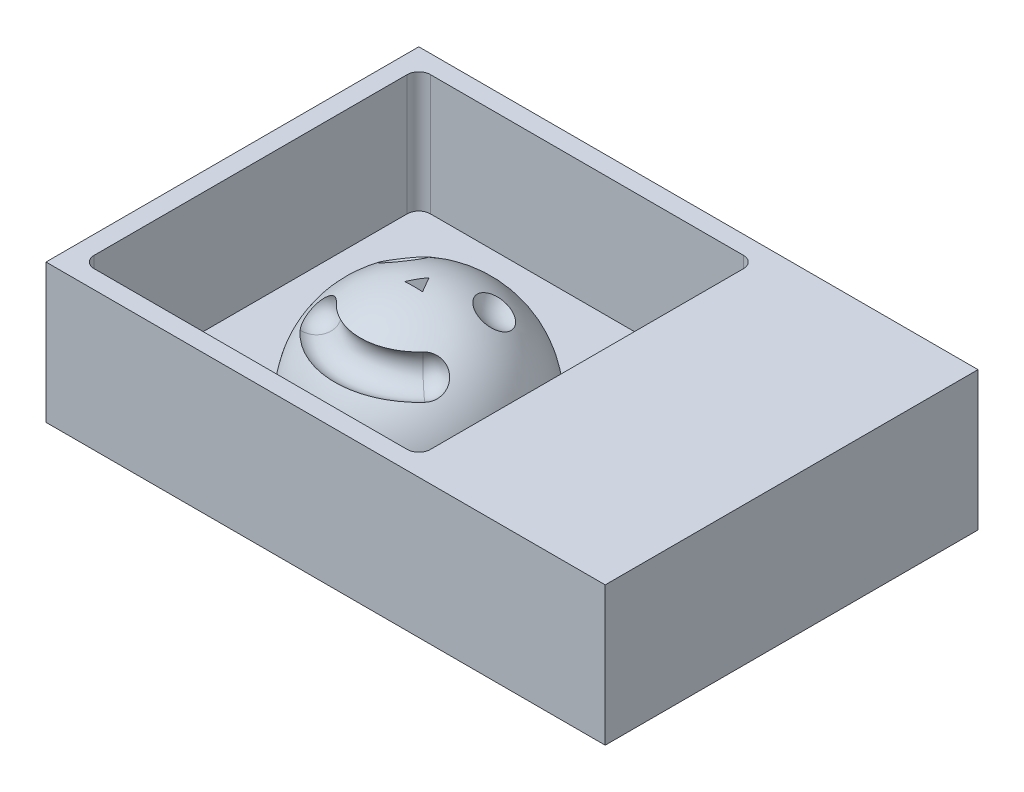
ISO-10303-21;
HEADER;
FILE_DESCRIPTION(('STEP AP214'),'2;1');
FILE_NAME('part.step','',(''),(''),'','','');
FILE_SCHEMA(('AUTOMOTIVE_DESIGN { 1 0 10303 214 1 1 1 1 }'));
ENDSEC;
DATA;
#1=APPLICATION_CONTEXT('core data for automotive mechanical design processes');
#2=APPLICATION_PROTOCOL_DEFINITION('international standard','automotive_design',2000,#1);
#3=PRODUCT_CONTEXT('',#1,'mechanical');
#4=PRODUCT('Part','Part','',(#3));
#5=PRODUCT_RELATED_PRODUCT_CATEGORY('part','',(#4));
#6=PRODUCT_DEFINITION_FORMATION('','',#4);
#7=PRODUCT_DEFINITION_CONTEXT('part definition',#1,'design');
#8=PRODUCT_DEFINITION('design','',#6,#7);
#9=PRODUCT_DEFINITION_SHAPE('','',#8);
#10=(LENGTH_UNIT() NAMED_UNIT(*) SI_UNIT(.MILLI.,.METRE.));
#11=(NAMED_UNIT(*) PLANE_ANGLE_UNIT() SI_UNIT($,.RADIAN.));
#12=(NAMED_UNIT(*) SI_UNIT($,.STERADIAN.) SOLID_ANGLE_UNIT());
#13=UNCERTAINTY_MEASURE_WITH_UNIT(LENGTH_MEASURE(1.E-05),#10,'distance_accuracy_value','');
#14=(GEOMETRIC_REPRESENTATION_CONTEXT(3) GLOBAL_UNCERTAINTY_ASSIGNED_CONTEXT((#13)) GLOBAL_UNIT_ASSIGNED_CONTEXT((#10,
#11,#12)) REPRESENTATION_CONTEXT('',''));
#15=CARTESIAN_POINT('',(0.,0.,0.));
#16=DIRECTION('',(0.,0.,1.));
#17=DIRECTION('',(1.,0.,0.));
#18=AXIS2_PLACEMENT_3D('',#15,#16,#17);
#19=CARTESIAN_POINT('',(-153.,38.,0.));
#20=DIRECTION('',(1.,0.,0.));
#21=DIRECTION('',(0.,0.,-1.));
#22=AXIS2_PLACEMENT_3D('',#19,#20,#21);
#23=PLANE('',#22);
#24=DIRECTION('',(0.,0.,1.));
#25=VECTOR('',#24,1.);
#26=CARTESIAN_POINT('',(-153.,0.,0.));
#27=LINE('',#26,#25);
#28=CARTESIAN_POINT('',(-153.,0.,-102.));
#29=VERTEX_POINT('',#28);
#30=CARTESIAN_POINT('',(-153.,0.,0.));
#31=VERTEX_POINT('',#30);
#32=EDGE_CURVE('E222',#29,#31,#27,.T.);
#33=ORIENTED_EDGE('',*,*,#32,.T.);
#34=DIRECTION('',(0.,-1.,0.));
#35=VECTOR('',#34,1.);
#36=CARTESIAN_POINT('',(-153.,38.,0.));
#37=LINE('',#36,#35);
#38=CARTESIAN_POINT('',(-153.,38.,0.));
#39=VERTEX_POINT('',#38);
#40=EDGE_CURVE('E299',#39,#31,#37,.T.);
#41=ORIENTED_EDGE('',*,*,#40,.F.);
#42=DIRECTION('',(0.,0.,1.));
#43=VECTOR('',#42,1.);
#44=CARTESIAN_POINT('',(-153.,38.,0.));
#45=LINE('',#44,#43);
#46=CARTESIAN_POINT('',(-153.,38.,-102.));
#47=VERTEX_POINT('',#46);
#48=EDGE_CURVE('E262',#47,#39,#45,.T.);
#49=ORIENTED_EDGE('',*,*,#48,.F.);
#50=DIRECTION('',(0.,-1.,0.));
#51=VECTOR('',#50,1.);
#52=CARTESIAN_POINT('',(-153.,38.,-102.));
#53=LINE('',#52,#51);
#54=EDGE_CURVE('E276',#47,#29,#53,.T.);
#55=ORIENTED_EDGE('',*,*,#54,.T.);
#56=EDGE_LOOP('',(#33,#41,#49,#55));
#57=FACE_BOUND('',#56,.T.);
#58=ADVANCED_FACE('F50',(#57),#23,.F.);
#59=CARTESIAN_POINT('',(-153.,38.,0.));
#60=DIRECTION('',(0.,0.,-1.));
#61=DIRECTION('',(-1.,0.,0.));
#62=AXIS2_PLACEMENT_3D('',#59,#60,#61);
#63=PLANE('',#62);
#64=DIRECTION('',(1.,0.,0.));
#65=VECTOR('',#64,1.);
#66=CARTESIAN_POINT('',(-153.,0.,0.));
#67=LINE('',#66,#65);
#68=CARTESIAN_POINT('',(0.,0.,0.));
#69=VERTEX_POINT('',#68);
#70=EDGE_CURVE('E280',#31,#69,#67,.T.);
#71=ORIENTED_EDGE('',*,*,#70,.T.);
#72=DIRECTION('',(0.,-1.,0.));
#73=VECTOR('',#72,1.);
#74=CARTESIAN_POINT('',(0.,38.,0.));
#75=LINE('',#74,#73);
#76=CARTESIAN_POINT('',(0.,38.,0.));
#77=VERTEX_POINT('',#76);
#78=EDGE_CURVE('E295',#77,#69,#75,.T.);
#79=ORIENTED_EDGE('',*,*,#78,.F.);
#80=DIRECTION('',(1.,0.,0.));
#81=VECTOR('',#80,1.);
#82=CARTESIAN_POINT('',(-153.,38.,0.));
#83=LINE('',#82,#81);
#84=EDGE_CURVE('E266',#39,#77,#83,.T.);
#85=ORIENTED_EDGE('',*,*,#84,.F.);
#86=ORIENTED_EDGE('',*,*,#40,.T.);
#87=EDGE_LOOP('',(#71,#79,#85,#86));
#88=FACE_BOUND('',#87,.T.);
#89=ADVANCED_FACE('F430',(#88),#63,.F.);
#90=CARTESIAN_POINT('',(0.,38.,0.));
#91=DIRECTION('',(-1.,0.,0.));
#92=DIRECTION('',(0.,0.,1.));
#93=AXIS2_PLACEMENT_3D('',#90,#91,#92);
#94=PLANE('',#93);
#95=DIRECTION('',(0.,0.,-1.));
#96=VECTOR('',#95,1.);
#97=CARTESIAN_POINT('',(0.,0.,0.));
#98=LINE('',#97,#96);
#99=CARTESIAN_POINT('',(0.,0.,-102.));
#100=VERTEX_POINT('',#99);
#101=EDGE_CURVE('E283',#69,#100,#98,.T.);
#102=ORIENTED_EDGE('',*,*,#101,.T.);
#103=DIRECTION('',(0.,-1.,0.));
#104=VECTOR('',#103,1.);
#105=CARTESIAN_POINT('',(0.,38.,-102.));
#106=LINE('',#105,#104);
#107=CARTESIAN_POINT('',(0.,38.,-102.));
#108=VERTEX_POINT('',#107);
#109=EDGE_CURVE('E291',#108,#100,#106,.T.);
#110=ORIENTED_EDGE('',*,*,#109,.F.);
#111=DIRECTION('',(0.,0.,-1.));
#112=VECTOR('',#111,1.);
#113=CARTESIAN_POINT('',(0.,38.,0.));
#114=LINE('',#113,#112);
#115=EDGE_CURVE('E270',#77,#108,#114,.T.);
#116=ORIENTED_EDGE('',*,*,#115,.F.);
#117=ORIENTED_EDGE('',*,*,#78,.T.);
#118=EDGE_LOOP('',(#102,#110,#116,#117));
#119=FACE_BOUND('',#118,.T.);
#120=ADVANCED_FACE('F436',(#119),#94,.F.);
#121=CARTESIAN_POINT('',(-153.,38.,-102.));
#122=DIRECTION('',(0.,0.,1.));
#123=DIRECTION('',(1.,0.,0.));
#124=AXIS2_PLACEMENT_3D('',#121,#122,#123);
#125=PLANE('',#124);
#126=DIRECTION('',(-1.,0.,0.));
#127=VECTOR('',#126,1.);
#128=CARTESIAN_POINT('',(-153.,0.,-102.));
#129=LINE('',#128,#127);
#130=EDGE_CURVE('E267',#100,#29,#129,.T.);
#131=ORIENTED_EDGE('',*,*,#130,.T.);
#132=ORIENTED_EDGE('',*,*,#54,.F.);
#133=DIRECTION('',(-1.,0.,0.));
#134=VECTOR('',#133,1.);
#135=CARTESIAN_POINT('',(-153.,38.,-102.));
#136=LINE('',#135,#134);
#137=EDGE_CURVE('E273',#108,#47,#136,.T.);
#138=ORIENTED_EDGE('',*,*,#137,.F.);
#139=ORIENTED_EDGE('',*,*,#109,.T.);
#140=EDGE_LOOP('',(#131,#132,#138,#139));
#141=FACE_BOUND('',#140,.T.);
#142=ADVANCED_FACE('F484',(#141),#125,.F.);
#143=CARTESIAN_POINT('',(0.,38.,0.));
#144=DIRECTION('',(0.,-1.,0.));
#145=DIRECTION('',(0.,0.,-1.));
#146=AXIS2_PLACEMENT_3D('',#143,#144,#145);
#147=PLANE('',#146);
#148=DIRECTION('',(1.,0.,0.));
#149=VECTOR('',#148,1.);
#150=CARTESIAN_POINT('',(-148.,38.,-97.));
#151=LINE('',#150,#149);
#152=CARTESIAN_POINT('',(-144.825,38.,-97.));
#153=VERTEX_POINT('',#152);
#154=CARTESIAN_POINT('',(-59.175,38.,-97.));
#155=VERTEX_POINT('',#154);
#156=EDGE_CURVE('E254',#153,#155,#151,.T.);
#157=ORIENTED_EDGE('',*,*,#156,.T.);
#158=CARTESIAN_POINT('',(-59.175,38.,-93.825));
#159=DIRECTION('',(0.,-1.,0.));
#160=DIRECTION('',(0.,0.,-1.));
#161=AXIS2_PLACEMENT_3D('',#158,#159,#160);
#162=CIRCLE('',#161,3.175);
#163=CARTESIAN_POINT('',(-56.,38.,-93.825));
#164=VERTEX_POINT('',#163);
#165=EDGE_CURVE('E249',#155,#164,#162,.T.);
#166=ORIENTED_EDGE('',*,*,#165,.T.);
#167=DIRECTION('',(0.,0.,1.));
#168=VECTOR('',#167,1.);
#169=CARTESIAN_POINT('',(-56.,38.,-97.));
#170=LINE('',#169,#168);
#171=CARTESIAN_POINT('',(-56.,38.,-8.17500000000001));
#172=VERTEX_POINT('',#171);
#173=EDGE_CURVE('E229',#164,#172,#170,.T.);
#174=ORIENTED_EDGE('',*,*,#173,.T.);
#175=CARTESIAN_POINT('',(-59.175,38.,-8.17500000000001));
#176=DIRECTION('',(0.,-1.,0.));
#177=DIRECTION('',(0.,0.,-1.));
#178=AXIS2_PLACEMENT_3D('',#175,#176,#177);
#179=CIRCLE('',#178,3.175);
#180=CARTESIAN_POINT('',(-59.175,38.,-5.00000000000002));
#181=VERTEX_POINT('',#180);
#182=EDGE_CURVE('E243',#172,#181,#179,.T.);
#183=ORIENTED_EDGE('',*,*,#182,.T.);
#184=DIRECTION('',(1.,0.,0.));
#185=VECTOR('',#184,1.);
#186=CARTESIAN_POINT('',(-148.,38.,-5.));
#187=LINE('',#186,#185);
#188=CARTESIAN_POINT('',(-144.825,38.,-5.));
#189=VERTEX_POINT('',#188);
#190=EDGE_CURVE('E180',#189,#181,#187,.T.);
#191=ORIENTED_EDGE('',*,*,#190,.F.);
#192=CARTESIAN_POINT('',(-144.825,38.,-8.175));
#193=DIRECTION('',(0.,-1.,0.));
#194=DIRECTION('',(0.,0.,-1.));
#195=AXIS2_PLACEMENT_3D('',#192,#193,#194);
#196=CIRCLE('',#195,3.175);
#197=CARTESIAN_POINT('',(-148.,38.,-8.175));
#198=VERTEX_POINT('',#197);
#199=EDGE_CURVE('E238',#189,#198,#196,.T.);
#200=ORIENTED_EDGE('',*,*,#199,.T.);
#201=DIRECTION('',(0.,0.,1.));
#202=VECTOR('',#201,1.);
#203=CARTESIAN_POINT('',(-148.,38.,-97.));
#204=LINE('',#203,#202);
#205=CARTESIAN_POINT('',(-148.,38.,-93.825));
#206=VERTEX_POINT('',#205);
#207=EDGE_CURVE('E208',#206,#198,#204,.T.);
#208=ORIENTED_EDGE('',*,*,#207,.F.);
#209=CARTESIAN_POINT('',(-144.825,38.,-93.825));
#210=DIRECTION('',(0.,-1.,0.));
#211=DIRECTION('',(0.,0.,-1.));
#212=AXIS2_PLACEMENT_3D('',#209,#210,#211);
#213=CIRCLE('',#212,3.175);
#214=EDGE_CURVE('E242',#206,#153,#213,.T.);
#215=ORIENTED_EDGE('',*,*,#214,.T.);
#216=EDGE_LOOP('',(#157,#166,#174,#183,#191,#200,#208,#215));
#217=FACE_BOUND('',#216,.T.);
#218=ORIENTED_EDGE('',*,*,#48,.T.);
#219=ORIENTED_EDGE('',*,*,#84,.T.);
#220=ORIENTED_EDGE('',*,*,#115,.T.);
#221=ORIENTED_EDGE('',*,*,#137,.T.);
#222=EDGE_LOOP('',(#218,#219,#220,#221));
#223=FACE_BOUND('',#222,.T.);
#224=ADVANCED_FACE('F356',(#217,#223),#147,.F.);
#225=CARTESIAN_POINT('',(0.,0.,0.));
#226=DIRECTION('',(0.,-1.,0.));
#227=DIRECTION('',(0.,0.,-1.));
#228=AXIS2_PLACEMENT_3D('',#225,#226,#227);
#229=PLANE('',#228);
#230=ORIENTED_EDGE('',*,*,#32,.F.);
#231=ORIENTED_EDGE('',*,*,#130,.F.);
#232=ORIENTED_EDGE('',*,*,#101,.F.);
#233=ORIENTED_EDGE('',*,*,#70,.F.);
#234=EDGE_LOOP('',(#230,#231,#232,#233));
#235=FACE_BOUND('',#234,.T.);
#236=ADVANCED_FACE('F481',(#235),#229,.T.);
#237=CARTESIAN_POINT('',(-148.,5.,-5.));
#238=DIRECTION('',(0.,0.,1.));
#239=DIRECTION('',(1.,0.,0.));
#240=AXIS2_PLACEMENT_3D('',#237,#238,#239);
#241=PLANE('',#240);
#242=ORIENTED_EDGE('',*,*,#190,.T.);
#243=DIRECTION('',(0.,1.,0.));
#244=VECTOR('',#243,1.);
#245=CARTESIAN_POINT('',(-59.175,5.,-5.00000000000002));
#246=LINE('',#245,#244);
#247=CARTESIAN_POINT('',(-59.175,5.,-5.00000000000002));
#248=VERTEX_POINT('',#247);
#249=EDGE_CURVE('E318',#181,#248,#246,.F.);
#250=ORIENTED_EDGE('',*,*,#249,.T.);
#251=DIRECTION('',(1.,0.,0.));
#252=VECTOR('',#251,1.);
#253=CARTESIAN_POINT('',(-148.,5.,-5.));
#254=LINE('',#253,#252);
#255=CARTESIAN_POINT('',(-144.825,5.,-5.));
#256=VERTEX_POINT('',#255);
#257=EDGE_CURVE('E203',#256,#248,#254,.T.);
#258=ORIENTED_EDGE('',*,*,#257,.F.);
#259=DIRECTION('',(0.,1.,0.));
#260=VECTOR('',#259,1.);
#261=CARTESIAN_POINT('',(-144.825,38.,-5.));
#262=LINE('',#261,#260);
#263=EDGE_CURVE('E314',#256,#189,#262,.T.);
#264=ORIENTED_EDGE('',*,*,#263,.T.);
#265=EDGE_LOOP('',(#242,#250,#258,#264));
#266=FACE_BOUND('',#265,.T.);
#267=ADVANCED_FACE('F363',(#266),#241,.F.);
#268=CARTESIAN_POINT('',(-148.,5.,-97.));
#269=DIRECTION('',(-1.,0.,0.));
#270=DIRECTION('',(0.,0.,1.));
#271=AXIS2_PLACEMENT_3D('',#268,#269,#270);
#272=PLANE('',#271);
#273=ORIENTED_EDGE('',*,*,#207,.T.);
#274=DIRECTION('',(0.,1.,0.));
#275=VECTOR('',#274,1.);
#276=CARTESIAN_POINT('',(-148.,5.,-8.175));
#277=LINE('',#276,#275);
#278=CARTESIAN_POINT('',(-148.,5.,-8.175));
#279=VERTEX_POINT('',#278);
#280=EDGE_CURVE('E337',#198,#279,#277,.F.);
#281=ORIENTED_EDGE('',*,*,#280,.T.);
#282=DIRECTION('',(0.,0.,1.));
#283=VECTOR('',#282,1.);
#284=CARTESIAN_POINT('',(-148.,5.,-97.));
#285=LINE('',#284,#283);
#286=CARTESIAN_POINT('',(-148.,5.,-93.825));
#287=VERTEX_POINT('',#286);
#288=EDGE_CURVE('E217',#287,#279,#285,.T.);
#289=ORIENTED_EDGE('',*,*,#288,.F.);
#290=DIRECTION('',(0.,1.,0.));
#291=VECTOR('',#290,1.);
#292=CARTESIAN_POINT('',(-148.,5.,-93.825));
#293=LINE('',#292,#291);
#294=EDGE_CURVE('E333',#287,#206,#293,.T.);
#295=ORIENTED_EDGE('',*,*,#294,.T.);
#296=EDGE_LOOP('',(#273,#281,#289,#295));
#297=FACE_BOUND('',#296,.T.);
#298=ADVANCED_FACE('F471',(#297),#272,.F.);
#299=CARTESIAN_POINT('',(-148.,5.,-97.));
#300=DIRECTION('',(0.,0.,1.));
#301=DIRECTION('',(1.,0.,0.));
#302=AXIS2_PLACEMENT_3D('',#299,#300,#301);
#303=PLANE('',#302);
#304=ORIENTED_EDGE('',*,*,#156,.F.);
#305=DIRECTION('',(0.,1.,0.));
#306=VECTOR('',#305,1.);
#307=CARTESIAN_POINT('',(-144.825,5.,-97.));
#308=LINE('',#307,#306);
#309=CARTESIAN_POINT('',(-144.825,5.,-97.));
#310=VERTEX_POINT('',#309);
#311=EDGE_CURVE('E343',#153,#310,#308,.F.);
#312=ORIENTED_EDGE('',*,*,#311,.T.);
#313=DIRECTION('',(1.,0.,0.));
#314=VECTOR('',#313,1.);
#315=CARTESIAN_POINT('',(-148.,5.,-97.));
#316=LINE('',#315,#314);
#317=CARTESIAN_POINT('',(-59.175,5.,-97.));
#318=VERTEX_POINT('',#317);
#319=EDGE_CURVE('E223',#310,#318,#316,.T.);
#320=ORIENTED_EDGE('',*,*,#319,.T.);
#321=DIRECTION('',(0.,1.,0.));
#322=VECTOR('',#321,1.);
#323=CARTESIAN_POINT('',(-59.175,38.,-97.));
#324=LINE('',#323,#322);
#325=EDGE_CURVE('E340',#318,#155,#324,.T.);
#326=ORIENTED_EDGE('',*,*,#325,.T.);
#327=EDGE_LOOP('',(#304,#312,#320,#326));
#328=FACE_BOUND('',#327,.T.);
#329=ADVANCED_FACE('F379',(#328),#303,.T.);
#330=CARTESIAN_POINT('',(-56.,5.,-97.));
#331=DIRECTION('',(-1.,0.,0.));
#332=DIRECTION('',(0.,0.,1.));
#333=AXIS2_PLACEMENT_3D('',#330,#331,#332);
#334=PLANE('',#333);
#335=DIRECTION('',(0.,0.,1.));
#336=VECTOR('',#335,1.);
#337=CARTESIAN_POINT('',(-56.,5.,-97.));
#338=LINE('',#337,#336);
#339=CARTESIAN_POINT('',(-56.,5.,-93.825));
#340=VERTEX_POINT('',#339);
#341=CARTESIAN_POINT('',(-56.,5.,-8.17500000000001));
#342=VERTEX_POINT('',#341);
#343=EDGE_CURVE('E207',#340,#342,#338,.T.);
#344=ORIENTED_EDGE('',*,*,#343,.T.);
#345=DIRECTION('',(0.,1.,0.));
#346=VECTOR('',#345,1.);
#347=CARTESIAN_POINT('',(-56.,5.,-8.17500000000001));
#348=LINE('',#347,#346);
#349=EDGE_CURVE('E310',#342,#172,#348,.T.);
#350=ORIENTED_EDGE('',*,*,#349,.T.);
#351=ORIENTED_EDGE('',*,*,#173,.F.);
#352=DIRECTION('',(0.,1.,0.));
#353=VECTOR('',#352,1.);
#354=CARTESIAN_POINT('',(-56.,5.,-93.825));
#355=LINE('',#354,#353);
#356=EDGE_CURVE('E307',#164,#340,#355,.F.);
#357=ORIENTED_EDGE('',*,*,#356,.T.);
#358=EDGE_LOOP('',(#344,#350,#351,#357));
#359=FACE_BOUND('',#358,.T.);
#360=ADVANCED_FACE('F374',(#359),#334,.T.);
#361=CARTESIAN_POINT('',(0.,5.,0.));
#362=DIRECTION('',(0.,-1.,0.));
#363=DIRECTION('',(0.,0.,-1.));
#364=AXIS2_PLACEMENT_3D('',#361,#362,#363);
#365=PLANE('',#364);
#366=CARTESIAN_POINT('',(-102.,5.,-51.));
#367=DIRECTION('',(0.,-1.,0.));
#368=DIRECTION('',(0.,0.,-1.));
#369=AXIS2_PLACEMENT_3D('',#366,#367,#368);
#370=CIRCLE('',#369,28.);
#371=CARTESIAN_POINT('',(-102.,5.,-79.));
#372=VERTEX_POINT('',#371);
#373=EDGE_CURVE('E303',#372,#372,#370,.F.);
#374=ORIENTED_EDGE('',*,*,#373,.F.);
#375=EDGE_LOOP('',(#374));
#376=FACE_BOUND('',#375,.T.);
#377=ORIENTED_EDGE('',*,*,#257,.T.);
#378=CARTESIAN_POINT('',(-59.175,5.,-8.17500000000001));
#379=DIRECTION('',(0.,-1.,0.));
#380=DIRECTION('',(0.,0.,-1.));
#381=AXIS2_PLACEMENT_3D('',#378,#379,#380);
#382=CIRCLE('',#381,3.175);
#383=EDGE_CURVE('E330',#248,#342,#382,.F.);
#384=ORIENTED_EDGE('',*,*,#383,.T.);
#385=ORIENTED_EDGE('',*,*,#343,.F.);
#386=CARTESIAN_POINT('',(-59.175,5.,-93.825));
#387=DIRECTION('',(0.,-1.,0.));
#388=DIRECTION('',(0.,0.,-1.));
#389=AXIS2_PLACEMENT_3D('',#386,#387,#388);
#390=CIRCLE('',#389,3.175);
#391=EDGE_CURVE('E321',#340,#318,#390,.F.);
#392=ORIENTED_EDGE('',*,*,#391,.T.);
#393=ORIENTED_EDGE('',*,*,#319,.F.);
#394=CARTESIAN_POINT('',(-144.825,5.,-93.825));
#395=DIRECTION('',(0.,-1.,0.));
#396=DIRECTION('',(0.,0.,-1.));
#397=AXIS2_PLACEMENT_3D('',#394,#395,#396);
#398=CIRCLE('',#397,3.175);
#399=EDGE_CURVE('E324',#310,#287,#398,.F.);
#400=ORIENTED_EDGE('',*,*,#399,.T.);
#401=ORIENTED_EDGE('',*,*,#288,.T.);
#402=CARTESIAN_POINT('',(-144.825,5.,-8.175));
#403=DIRECTION('',(0.,-1.,0.));
#404=DIRECTION('',(0.,0.,-1.));
#405=AXIS2_PLACEMENT_3D('',#402,#403,#404);
#406=CIRCLE('',#405,3.175);
#407=EDGE_CURVE('E327',#279,#256,#406,.F.);
#408=ORIENTED_EDGE('',*,*,#407,.T.);
#409=EDGE_LOOP('',(#377,#384,#385,#392,#393,#400,#401,#408));
#410=FACE_BOUND('',#409,.T.);
#411=ADVANCED_FACE('F371',(#376,#410),#365,.F.);
#412=CARTESIAN_POINT('',(-102.,5.,-51.));
#413=DIRECTION('',(-1.,0.,0.));
#414=DIRECTION('',(0.,0.,1.));
#415=AXIS2_PLACEMENT_3D('',#412,#413,#414);
#416=SPHERICAL_SURFACE('',#415,28.);
#417=CARTESIAN_POINT('',(-102.,20.9893085029547,-51.));
#418=DIRECTION('',(0.,-1.,0.));
#419=DIRECTION('',(0.,0.,-1.));
#420=AXIS2_PLACEMENT_3D('',#417,#418,#419);
#421=CIRCLE('',#420,22.9856914970453);
#422=CARTESIAN_POINT('',(-84.9122670103515,20.9893085029547,-35.6262758294609));
#423=VERTEX_POINT('',#422);
#424=CARTESIAN_POINT('',(-119.087732989649,20.9893085029547,-35.626275829461));
#425=VERTEX_POINT('',#424);
#426=EDGE_CURVE('E393',#423,#425,#421,.T.);
#427=ORIENTED_EDGE('',*,*,#426,.T.);
#428=CARTESIAN_POINT('',(-116.487151568992,24.4875,-37.9660023144446));
#429=DIRECTION('',(-0.525668408698463,0.707106781186547,0.472940507988506));
#430=DIRECTION('',(-0.802532408736901,-0.596608525690798,0.));
#431=AXIS2_PLACEMENT_3D('',#428,#429,#430);
#432=CIRCLE('',#431,4.94718985889971);
#433=CARTESIAN_POINT('',(-113.886570148335,27.9856914970453,-40.3057287994282));
#434=VERTEX_POINT('',#433);
#435=EDGE_CURVE('E13',#425,#434,#432,.F.);
#436=ORIENTED_EDGE('',*,*,#435,.T.);
#437=CARTESIAN_POINT('',(-102.,27.9856914970453,-51.));
#438=DIRECTION('',(0.,1.,0.));
#439=DIRECTION('',(0.,0.,1.));
#440=AXIS2_PLACEMENT_3D('',#437,#438,#439);
#441=CIRCLE('',#440,15.9893085029547);
#442=CARTESIAN_POINT('',(-90.1134298516654,27.9856914970453,-40.3057287994281));
#443=VERTEX_POINT('',#442);
#444=EDGE_CURVE('E403',#434,#443,#441,.T.);
#445=ORIENTED_EDGE('',*,*,#444,.T.);
#446=CARTESIAN_POINT('',(-87.5128484310084,24.4875,-37.9660023144445));
#447=DIRECTION('',(0.525668408698462,0.707106781186547,0.472940507988508));
#448=DIRECTION('',(-0.802532408736902,0.596608525690797,0.));
#449=AXIS2_PLACEMENT_3D('',#446,#447,#448);
#450=CIRCLE('',#449,4.94718985889971);
#451=EDGE_CURVE('E59',#443,#423,#450,.F.);
#452=ORIENTED_EDGE('',*,*,#451,.T.);
#453=EDGE_LOOP('',(#427,#436,#445,#452));
#454=FACE_BOUND('',#453,.T.);
#455=CARTESIAN_POINT('',(-114.431678872713,28.2058005623978,-59.1939278551461));
#456=DIRECTION('',(-0.450886170739879,0.841654185381107,-0.297186630362126));
#457=DIRECTION('',(-0.881479970028782,-0.472221412515419,0.));
#458=AXIS2_PLACEMENT_3D('',#455,#456,#457);
#459=CIRCLE('',#458,4.87890632914959);
#460=CARTESIAN_POINT('',(-118.732337077505,25.9018765241164,-59.1939278551461));
#461=VERTEX_POINT('',#460);
#462=EDGE_CURVE('E192',#461,#461,#459,.F.);
#463=ORIENTED_EDGE('',*,*,#462,.T.);
#464=EDGE_LOOP('',(#463));
#465=FACE_BOUND('',#464,.T.);
#466=CARTESIAN_POINT('',(-89.5683211272869,28.2058005623978,-59.1939278551461));
#467=DIRECTION('',(0.450886170739879,0.841654185381107,-0.297186630362126));
#468=DIRECTION('',(-0.881479970028782,0.472221412515419,0.));
#469=AXIS2_PLACEMENT_3D('',#466,#467,#468);
#470=CIRCLE('',#469,4.87890632914959);
#471=CARTESIAN_POINT('',(-93.8689793320789,30.5097246006793,-59.1939278551461));
#472=VERTEX_POINT('',#471);
#473=EDGE_CURVE('E394',#472,#472,#470,.F.);
#474=ORIENTED_EDGE('',*,*,#473,.T.);
#475=EDGE_LOOP('',(#474));
#476=FACE_BOUND('',#475,.T.);
#477=CARTESIAN_POINT('',(-102.,6.74489036649277,-57.0851558670257));
#478=DIRECTION('',(0.,-0.275637355816999,0.961261695938319));
#479=DIRECTION('',(0.,-0.961261695938319,-0.275637355816999));
#480=AXIS2_PLACEMENT_3D('',#477,#478,#479);
#481=CIRCLE('',#480,27.2750111949184);
#482=CARTESIAN_POINT('',(-99.5700025516871,32.8590526855262,-49.5970403190864));
#483=VERTEX_POINT('',#482);
#484=CARTESIAN_POINT('',(-104.429997448313,32.8590526855262,-49.5970403190864));
#485=VERTEX_POINT('',#484);
#486=EDGE_CURVE('E384',#483,#485,#481,.T.);
#487=ORIENTED_EDGE('',*,*,#486,.T.);
#488=CARTESIAN_POINT('',(-96.7301004331678,6.74489036649277,-47.9574220664871));
#489=DIRECTION('',(-0.832477048367497,-0.275637355816999,-0.480630847969159));
#490=DIRECTION('',(-0.5,0.,0.866025403784439));
#491=AXIS2_PLACEMENT_3D('',#488,#489,#490);
#492=CIRCLE('',#491,27.2750111949184);
#493=CARTESIAN_POINT('',(-102.,32.8590526855262,-53.8059193618272));
#494=VERTEX_POINT('',#493);
#495=EDGE_CURVE('E388',#485,#494,#492,.T.);
#496=ORIENTED_EDGE('',*,*,#495,.T.);
#497=CARTESIAN_POINT('',(-107.269899566832,6.74489036649277,-47.9574220664871));
#498=DIRECTION('',(0.832477048367497,-0.275637355816999,-0.480630847969159));
#499=DIRECTION('',(-0.5,0.,-0.866025403784439));
#500=AXIS2_PLACEMENT_3D('',#497,#498,#499);
#501=CIRCLE('',#500,27.2750111949184);
#502=EDGE_CURVE('E175',#494,#483,#501,.T.);
#503=ORIENTED_EDGE('',*,*,#502,.T.);
#504=EDGE_LOOP('',(#487,#496,#503));
#505=FACE_BOUND('',#504,.T.);
#506=ORIENTED_EDGE('',*,*,#373,.T.);
#507=EDGE_LOOP('',(#506));
#508=FACE_BOUND('',#507,.T.);
#509=ADVANCED_FACE('F414',(#454,#465,#476,#505,#508),#416,.T.);
#510=CARTESIAN_POINT('',(-59.175,5.,-8.17500000000001));
#511=DIRECTION('',(0.,1.,0.));
#512=DIRECTION('',(0.,0.,1.));
#513=AXIS2_PLACEMENT_3D('',#510,#511,#512);
#514=CYLINDRICAL_SURFACE('',#513,3.175);
#515=ORIENTED_EDGE('',*,*,#383,.F.);
#516=ORIENTED_EDGE('',*,*,#249,.F.);
#517=ORIENTED_EDGE('',*,*,#182,.F.);
#518=ORIENTED_EDGE('',*,*,#349,.F.);
#519=EDGE_LOOP('',(#515,#516,#517,#518));
#520=FACE_BOUND('',#519,.T.);
#521=ADVANCED_FACE('F367',(#520),#514,.F.);
#522=CARTESIAN_POINT('',(-144.825,5.,-8.175));
#523=DIRECTION('',(0.,-1.,0.));
#524=DIRECTION('',(0.,0.,-1.));
#525=AXIS2_PLACEMENT_3D('',#522,#523,#524);
#526=CYLINDRICAL_SURFACE('',#525,3.175);
#527=ORIENTED_EDGE('',*,*,#407,.F.);
#528=ORIENTED_EDGE('',*,*,#280,.F.);
#529=ORIENTED_EDGE('',*,*,#199,.F.);
#530=ORIENTED_EDGE('',*,*,#263,.F.);
#531=EDGE_LOOP('',(#527,#528,#529,#530));
#532=FACE_BOUND('',#531,.T.);
#533=ADVANCED_FACE('F443',(#532),#526,.F.);
#534=CARTESIAN_POINT('',(-144.825,5.,-93.825));
#535=DIRECTION('',(0.,1.,0.));
#536=DIRECTION('',(0.,0.,1.));
#537=AXIS2_PLACEMENT_3D('',#534,#535,#536);
#538=CYLINDRICAL_SURFACE('',#537,3.175);
#539=ORIENTED_EDGE('',*,*,#399,.F.);
#540=ORIENTED_EDGE('',*,*,#311,.F.);
#541=ORIENTED_EDGE('',*,*,#214,.F.);
#542=ORIENTED_EDGE('',*,*,#294,.F.);
#543=EDGE_LOOP('',(#539,#540,#541,#542));
#544=FACE_BOUND('',#543,.T.);
#545=ADVANCED_FACE('F446',(#544),#538,.F.);
#546=CARTESIAN_POINT('',(-59.175,5.,-93.825));
#547=DIRECTION('',(0.,-1.,0.));
#548=DIRECTION('',(0.,0.,-1.));
#549=AXIS2_PLACEMENT_3D('',#546,#547,#548);
#550=CYLINDRICAL_SURFACE('',#549,3.175);
#551=ORIENTED_EDGE('',*,*,#391,.F.);
#552=ORIENTED_EDGE('',*,*,#356,.F.);
#553=ORIENTED_EDGE('',*,*,#165,.F.);
#554=ORIENTED_EDGE('',*,*,#325,.F.);
#555=EDGE_LOOP('',(#551,#552,#553,#554));
#556=FACE_BOUND('',#555,.T.);
#557=ADVANCED_FACE('F382',(#556),#550,.F.);
#558=CARTESIAN_POINT('',(-99.8336477965032,33.,-57.6389834294934));
#559=DIRECTION('',(-0.832477048367497,-0.275637355816999,-0.480630847969159));
#560=DIRECTION('',(-0.5,0.,0.866025403784439));
#561=AXIS2_PLACEMENT_3D('',#558,#559,#560);
#562=PLANE('',#561);
#563=DIRECTION('',(-0.430836289233124,0.867471491850372,0.248743447565404));
#564=VECTOR('',#563,1.);
#565=CARTESIAN_POINT('',(-102.767664265461,29.5120118671968,-50.5567888296887));
#566=LINE('',#565,#564);
#567=CARTESIAN_POINT('',(-102.016712115149,28.,-50.99035125582));
#568=VERTEX_POINT('',#567);
#569=EDGE_CURVE('E186',#568,#485,#566,.T.);
#570=ORIENTED_EDGE('',*,*,#569,.F.);
#571=DIRECTION('',(-0.5,0.,0.866025403784439));
#572=VECTOR('',#571,1.);
#573=CARTESIAN_POINT('',(-98.5920038540777,28.,-56.9221199650963));
#574=LINE('',#573,#572);
#575=CARTESIAN_POINT('',(-102.,28.,-51.01929748836));
#576=VERTEX_POINT('',#575);
#577=EDGE_CURVE('E184',#576,#568,#574,.T.);
#578=ORIENTED_EDGE('',*,*,#577,.F.);
#579=DIRECTION('',(0.,0.867471491850371,-0.497486895130807));
#580=VECTOR('',#579,1.);
#581=CARTESIAN_POINT('',(-102.,-3.50199911358073,-32.9531917123654));
#582=LINE('',#581,#580);
#583=EDGE_CURVE('E168',#576,#494,#582,.T.);
#584=ORIENTED_EDGE('',*,*,#583,.T.);
#585=ORIENTED_EDGE('',*,*,#495,.F.);
#586=EDGE_LOOP('',(#570,#578,#584,#585));
#587=FACE_BOUND('',#586,.T.);
#588=ADVANCED_FACE('F185',(#587),#562,.F.);
#589=CARTESIAN_POINT('',(-53.1663522034969,33.,30.6956077565194));
#590=DIRECTION('',(0.832477048367497,-0.275637355816999,-0.480630847969159));
#591=DIRECTION('',(-0.5,0.,-0.866025403784439));
#592=AXIS2_PLACEMENT_3D('',#589,#590,#591);
#593=PLANE('',#592);
#594=ORIENTED_EDGE('',*,*,#583,.F.);
#595=DIRECTION('',(-0.5,0.,-0.866025403784439));
#596=VECTOR('',#595,1.);
#597=CARTESIAN_POINT('',(-54.4079961459224,28.,31.4124712209164));
#598=LINE('',#597,#596);
#599=CARTESIAN_POINT('',(-101.983287884851,28.,-50.99035125582));
#600=VERTEX_POINT('',#599);
#601=EDGE_CURVE('E173',#600,#576,#598,.T.);
#602=ORIENTED_EDGE('',*,*,#601,.F.);
#603=DIRECTION('',(0.430836289233124,0.867471491850372,0.248743447565404));
#604=VECTOR('',#603,1.);
#605=CARTESIAN_POINT('',(-81.0308191420433,70.1869507571515,-38.8934377869727));
#606=LINE('',#605,#604);
#607=EDGE_CURVE('E181',#600,#483,#606,.T.);
#608=ORIENTED_EDGE('',*,*,#607,.T.);
#609=ORIENTED_EDGE('',*,*,#502,.F.);
#610=EDGE_LOOP('',(#594,#602,#608,#609));
#611=FACE_BOUND('',#610,.T.);
#612=ADVANCED_FACE('F170',(#611),#593,.F.);
#613=CARTESIAN_POINT('',(0.,33.,-49.5566243270259));
#614=DIRECTION('',(0.,-0.275637355816999,0.961261695938319));
#615=DIRECTION('',(0.,-0.961261695938319,-0.275637355816999));
#616=AXIS2_PLACEMENT_3D('',#613,#614,#615);
#617=PLANE('',#616);
#618=ORIENTED_EDGE('',*,*,#607,.F.);
#619=DIRECTION('',(1.,0.,0.));
#620=VECTOR('',#619,1.);
#621=CARTESIAN_POINT('',(0.,28.,-50.99035125582));
#622=LINE('',#621,#620);
#623=EDGE_CURVE('E191',#568,#600,#622,.T.);
#624=ORIENTED_EDGE('',*,*,#623,.F.);
#625=ORIENTED_EDGE('',*,*,#569,.T.);
#626=ORIENTED_EDGE('',*,*,#486,.F.);
#627=EDGE_LOOP('',(#618,#624,#625,#626));
#628=FACE_BOUND('',#627,.T.);
#629=ADVANCED_FACE('F458',(#628),#617,.F.);
#630=CARTESIAN_POINT('',(0.,28.,0.));
#631=DIRECTION('',(0.,1.,0.));
#632=DIRECTION('',(0.,0.,1.));
#633=AXIS2_PLACEMENT_3D('',#630,#631,#632);
#634=PLANE('',#633);
#635=ORIENTED_EDGE('',*,*,#577,.T.);
#636=ORIENTED_EDGE('',*,*,#623,.T.);
#637=ORIENTED_EDGE('',*,*,#601,.T.);
#638=EDGE_LOOP('',(#635,#636,#637));
#639=FACE_BOUND('',#638,.T.);
#640=ADVANCED_FACE('F194',(#639),#634,.T.);
#641=CARTESIAN_POINT('',(-87.,33.,-60.8867513459481));
#642=DIRECTION('',(-1.,0.,0.));
#643=DIRECTION('',(0.,0.,-1.));
#644=AXIS2_PLACEMENT_3D('',#641,#642,#643);
#645=SPHERICAL_SURFACE('',#644,7.50000000000001);
#646=CARTESIAN_POINT('',(-87.,33.,-60.8867513459481));
#647=DIRECTION('',(0.450886170739879,0.841654185381107,-0.297186630362126));
#648=DIRECTION('',(-0.881479970028782,0.472221412515419,0.));
#649=AXIS2_PLACEMENT_3D('',#646,#647,#648);
#650=SPHERICAL_SURFACE('',#649,7.50000000000001);
#651=ORIENTED_EDGE('',*,*,#473,.F.);
#652=EDGE_LOOP('',(#651));
#653=FACE_BOUND('',#652,.T.);
#654=ADVANCED_FACE('F565',(#653),#650,.F.);
#655=CARTESIAN_POINT('',(-117.,33.,-60.8867513459481));
#656=DIRECTION('',(-1.,0.,0.));
#657=DIRECTION('',(0.,0.,-1.));
#658=AXIS2_PLACEMENT_3D('',#655,#656,#657);
#659=SPHERICAL_SURFACE('',#658,7.50000000000001);
#660=CARTESIAN_POINT('',(-117.,33.,-60.8867513459481));
#661=DIRECTION('',(-0.450886170739879,0.841654185381107,-0.297186630362126));
#662=DIRECTION('',(-0.881479970028782,-0.472221412515419,0.));
#663=AXIS2_PLACEMENT_3D('',#660,#661,#662);
#664=SPHERICAL_SURFACE('',#663,7.50000000000001);
#665=ORIENTED_EDGE('',*,*,#462,.F.);
#666=EDGE_LOOP('',(#665));
#667=FACE_BOUND('',#666,.T.);
#668=ADVANCED_FACE('F426',(#667),#664,.F.);
#669=CARTESIAN_POINT('',(-102.,25.,-51.));
#670=DIRECTION('',(0.,1.,0.));
#671=DIRECTION('',(0.,0.,1.));
#672=AXIS2_PLACEMENT_3D('',#669,#670,#671);
#673=TOROIDAL_SURFACE('',#672,20.,5.);
#674=ORIENTED_EDGE('',*,*,#426,.F.);
#675=CARTESIAN_POINT('',(-87.131852142151,25.,-37.6232223881406));
#676=DIRECTION('',(0.668838880592968,0.,-0.743407392892447));
#677=DIRECTION('',(-0.743407392892447,0.,-0.668838880592968));
#678=AXIS2_PLACEMENT_3D('',#675,#676,#677);
#679=CIRCLE('',#678,5.);
#680=EDGE_CURVE('E410',#423,#443,#679,.T.);
#681=ORIENTED_EDGE('',*,*,#680,.T.);
#682=ORIENTED_EDGE('',*,*,#444,.F.);
#683=CARTESIAN_POINT('',(-116.868147857849,25.,-37.6232223881406));
#684=DIRECTION('',(0.668838880592966,0.,0.743407392892449));
#685=DIRECTION('',(0.743407392892449,0.,-0.668838880592966));
#686=AXIS2_PLACEMENT_3D('',#683,#684,#685);
#687=CIRCLE('',#686,5.);
#688=EDGE_CURVE('E406',#434,#425,#687,.F.);
#689=ORIENTED_EDGE('',*,*,#688,.T.);
#690=EDGE_LOOP('',(#674,#681,#682,#689));
#691=FACE_BOUND('',#690,.T.);
#692=ADVANCED_FACE('F417',(#691),#673,.F.);
#693=CARTESIAN_POINT('',(-87.131852142151,25.,-37.6232223881406));
#694=DIRECTION('',(0.461748613235032,0.,-0.887010833178223));
#695=DIRECTION('',(-0.887010833178223,0.,-0.461748613235032));
#696=AXIS2_PLACEMENT_3D('',#693,#694,#695);
#697=SPHERICAL_SURFACE('',#696,5.);
#698=ORIENTED_EDGE('',*,*,#451,.F.);
#699=ORIENTED_EDGE('',*,*,#680,.F.);
#700=EDGE_LOOP('',(#698,#699));
#701=FACE_BOUND('',#700,.T.);
#702=ADVANCED_FACE('F419',(#701),#697,.F.);
#703=CARTESIAN_POINT('',(-116.868147857849,25.,-37.6232223881406));
#704=DIRECTION('',(0.461748613235031,0.,0.887010833178223));
#705=DIRECTION('',(0.887010833178223,0.,-0.461748613235031));
#706=AXIS2_PLACEMENT_3D('',#703,#704,#705);
#707=SPHERICAL_SURFACE('',#706,5.);
#708=ORIENTED_EDGE('',*,*,#435,.F.);
#709=ORIENTED_EDGE('',*,*,#688,.F.);
#710=EDGE_LOOP('',(#708,#709));
#711=FACE_BOUND('',#710,.T.);
#712=ADVANCED_FACE('F52',(#711),#707,.F.);
#713=CLOSED_SHELL('',(#58,#89,#120,#142,#224,#236,#267,#298,#329,#360,#411,#509,#521,#533,#545,
#557,#588,#612,#629,#640,#654,#668,#692,#702,#712));
#714=MANIFOLD_SOLID_BREP('B2',#713);
#715=ADVANCED_BREP_SHAPE_REPRESENTATION('',(#18,#714),#14);
#716=SHAPE_DEFINITION_REPRESENTATION(#9,#715);
ENDSEC;
END-ISO-10303-21;
